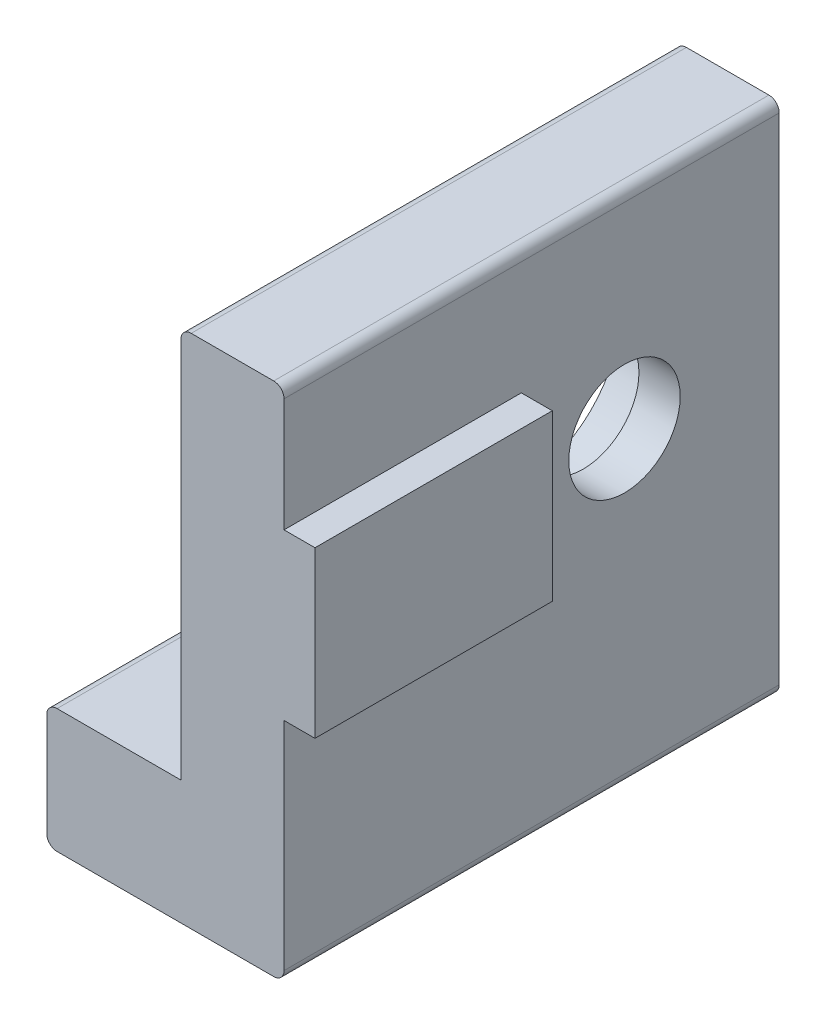
ISO-10303-21;
HEADER;
FILE_DESCRIPTION(('STEP AP214'),'2;1');
FILE_NAME('part.step','',(''),(''),'','','');
FILE_SCHEMA(('AUTOMOTIVE_DESIGN { 1 0 10303 214 1 1 1 1 }'));
ENDSEC;
DATA;
#1=APPLICATION_CONTEXT('core data for automotive mechanical design processes');
#2=APPLICATION_PROTOCOL_DEFINITION('international standard','automotive_design',2000,#1);
#3=PRODUCT_CONTEXT('',#1,'mechanical');
#4=PRODUCT('Part','Part','',(#3));
#5=PRODUCT_RELATED_PRODUCT_CATEGORY('part','',(#4));
#6=PRODUCT_DEFINITION_FORMATION('','',#4);
#7=PRODUCT_DEFINITION_CONTEXT('part definition',#1,'design');
#8=PRODUCT_DEFINITION('design','',#6,#7);
#9=PRODUCT_DEFINITION_SHAPE('','',#8);
#10=(LENGTH_UNIT() NAMED_UNIT(*) SI_UNIT(.MILLI.,.METRE.));
#11=(NAMED_UNIT(*) PLANE_ANGLE_UNIT() SI_UNIT($,.RADIAN.));
#12=(NAMED_UNIT(*) SI_UNIT($,.STERADIAN.) SOLID_ANGLE_UNIT());
#13=UNCERTAINTY_MEASURE_WITH_UNIT(LENGTH_MEASURE(1.E-05),#10,'distance_accuracy_value','');
#14=(GEOMETRIC_REPRESENTATION_CONTEXT(3) GLOBAL_UNCERTAINTY_ASSIGNED_CONTEXT((#13)) GLOBAL_UNIT_ASSIGNED_CONTEXT((#10,
#11,#12)) REPRESENTATION_CONTEXT('',''));
#15=CARTESIAN_POINT('',(0.,0.,0.));
#16=DIRECTION('',(0.,0.,1.));
#17=DIRECTION('',(1.,0.,0.));
#18=AXIS2_PLACEMENT_3D('',#15,#16,#17);
#19=CARTESIAN_POINT('',(0.,0.,24.));
#20=DIRECTION('',(1.,0.,0.));
#21=DIRECTION('',(0.,1.,0.));
#22=AXIS2_PLACEMENT_3D('',#19,#20,#21);
#23=PLANE('',#22);
#24=DIRECTION('',(0.,1.,0.));
#25=VECTOR('',#24,1.);
#26=CARTESIAN_POINT('',(0.,7.69614,15.6));
#27=LINE('',#26,#25);
#28=CARTESIAN_POINT('',(0.,7.69614,15.6));
#29=VERTEX_POINT('',#28);
#30=CARTESIAN_POINT('',(0.,9.48283,15.6));
#31=VERTEX_POINT('',#30);
#32=EDGE_CURVE('E208',#29,#31,#27,.T.);
#33=ORIENTED_EDGE('',*,*,#32,.F.);
#34=DIRECTION('',(0.,0.,-1.));
#35=VECTOR('',#34,1.);
#36=CARTESIAN_POINT('',(0.,7.69614,15.6));
#37=LINE('',#36,#35);
#38=CARTESIAN_POINT('',(0.,7.69614,12.));
#39=VERTEX_POINT('',#38);
#40=EDGE_CURVE('E191',#29,#39,#37,.T.);
#41=ORIENTED_EDGE('',*,*,#40,.T.);
#42=DIRECTION('',(0.,1.,0.));
#43=VECTOR('',#42,1.);
#44=CARTESIAN_POINT('',(0.,7.69614,12.));
#45=LINE('',#44,#43);
#46=CARTESIAN_POINT('',(0.,9.48283,12.));
#47=VERTEX_POINT('',#46);
#48=EDGE_CURVE('E221',#39,#47,#45,.T.);
#49=ORIENTED_EDGE('',*,*,#48,.T.);
#50=DIRECTION('',(0.,0.,-1.));
#51=VECTOR('',#50,1.);
#52=CARTESIAN_POINT('',(0.,9.48283,15.6));
#53=LINE('',#52,#51);
#54=EDGE_CURVE('E201',#31,#47,#53,.T.);
#55=ORIENTED_EDGE('',*,*,#54,.F.);
#56=EDGE_LOOP('',(#33,#41,#49,#55));
#57=FACE_BOUND('',#56,.T.);
#58=CARTESIAN_POINT('',(0.,2.5,7.5));
#59=DIRECTION('',(-1.,0.,0.));
#60=DIRECTION('',(0.,-1.,0.));
#61=AXIS2_PLACEMENT_3D('',#58,#59,#60);
#62=CIRCLE('',#61,4.8);
#63=CARTESIAN_POINT('',(0.,-2.3,7.5));
#64=VERTEX_POINT('',#63);
#65=EDGE_CURVE('E239',#64,#64,#62,.T.);
#66=ORIENTED_EDGE('',*,*,#65,.F.);
#67=EDGE_LOOP('',(#66));
#68=FACE_BOUND('',#67,.T.);
#69=DIRECTION('',(0.,-1.,0.));
#70=VECTOR('',#69,1.);
#71=CARTESIAN_POINT('',(0.,0.,24.));
#72=LINE('',#71,#70);
#73=CARTESIAN_POINT('',(0.,12.,24.));
#74=VERTEX_POINT('',#73);
#75=CARTESIAN_POINT('',(0.,-6.49999999999999,24.));
#76=VERTEX_POINT('',#75);
#77=EDGE_CURVE('E288',#74,#76,#72,.T.);
#78=ORIENTED_EDGE('',*,*,#77,.F.);
#79=DIRECTION('',(0.,0.,-1.));
#80=VECTOR('',#79,1.);
#81=CARTESIAN_POINT('',(0.,12.,24.));
#82=LINE('',#81,#80);
#83=CARTESIAN_POINT('',(0.,12.,0.));
#84=VERTEX_POINT('',#83);
#85=EDGE_CURVE('E355',#74,#84,#82,.T.);
#86=ORIENTED_EDGE('',*,*,#85,.T.);
#87=DIRECTION('',(0.,-1.,0.));
#88=VECTOR('',#87,1.);
#89=CARTESIAN_POINT('',(0.,0.,0.));
#90=LINE('',#89,#88);
#91=CARTESIAN_POINT('',(0.,-6.99999999999999,0.));
#92=VERTEX_POINT('',#91);
#93=EDGE_CURVE('E305',#84,#92,#90,.T.);
#94=ORIENTED_EDGE('',*,*,#93,.T.);
#95=CARTESIAN_POINT('',(0.,-6.99999999999999,1.18733454157178));
#96=DIRECTION('',(1.,0.,0.));
#97=DIRECTION('',(0.,0.,-1.));
#98=AXIS2_PLACEMENT_3D('',#95,#96,#97);
#99=ELLIPSE('',#98,1.18733454157178,0.5);
#100=CARTESIAN_POINT('',(0.,-6.49999999999999,1.18733454157178));
#101=VERTEX_POINT('',#100);
#102=EDGE_CURVE('E377',#92,#101,#99,.T.);
#103=ORIENTED_EDGE('',*,*,#102,.T.);
#104=DIRECTION('',(0.,0.,-1.));
#105=VECTOR('',#104,1.);
#106=CARTESIAN_POINT('',(0.,-6.49999999999999,24.));
#107=LINE('',#106,#105);
#108=EDGE_CURVE('E299',#76,#101,#107,.T.);
#109=ORIENTED_EDGE('',*,*,#108,.F.);
#110=EDGE_LOOP('',(#78,#86,#94,#103,#109));
#111=FACE_BOUND('',#110,.T.);
#112=DIRECTION('',(0.,1.,0.));
#113=VECTOR('',#112,1.);
#114=CARTESIAN_POINT('',(0.,-2.69614,15.6));
#115=LINE('',#114,#113);
#116=CARTESIAN_POINT('',(0.,-4.48283,15.6));
#117=VERTEX_POINT('',#116);
#118=CARTESIAN_POINT('',(0.,-2.69614,15.6));
#119=VERTEX_POINT('',#118);
#120=EDGE_CURVE('E202',#117,#119,#115,.T.);
#121=ORIENTED_EDGE('',*,*,#120,.F.);
#122=DIRECTION('',(0.,0.,-1.));
#123=VECTOR('',#122,1.);
#124=CARTESIAN_POINT('',(0.,-4.48283,15.6));
#125=LINE('',#124,#123);
#126=CARTESIAN_POINT('',(0.,-4.48283,12.));
#127=VERTEX_POINT('',#126);
#128=EDGE_CURVE('E229',#117,#127,#125,.T.);
#129=ORIENTED_EDGE('',*,*,#128,.T.);
#130=DIRECTION('',(0.,1.,0.));
#131=VECTOR('',#130,1.);
#132=CARTESIAN_POINT('',(0.,-2.69614,12.));
#133=LINE('',#132,#131);
#134=CARTESIAN_POINT('',(0.,-2.69614,12.));
#135=VERTEX_POINT('',#134);
#136=EDGE_CURVE('E212',#127,#135,#133,.T.);
#137=ORIENTED_EDGE('',*,*,#136,.T.);
#138=DIRECTION('',(0.,0.,-1.));
#139=VECTOR('',#138,1.);
#140=CARTESIAN_POINT('',(0.,-2.69614,15.6));
#141=LINE('',#140,#139);
#142=EDGE_CURVE('E226',#119,#135,#141,.T.);
#143=ORIENTED_EDGE('',*,*,#142,.F.);
#144=EDGE_LOOP('',(#121,#129,#137,#143));
#145=FACE_BOUND('',#144,.T.);
#146=ADVANCED_FACE('F39',(#57,#68,#111,#145),#23,.F.);
#147=CARTESIAN_POINT('',(6.5,2.5,7.5));
#148=DIRECTION('',(-1.,0.,0.));
#149=DIRECTION('',(0.,-1.,0.));
#150=AXIS2_PLACEMENT_3D('',#147,#148,#149);
#151=CYLINDRICAL_SURFACE('',#150,2.7);
#152=CARTESIAN_POINT('',(5.,2.5,7.5));
#153=DIRECTION('',(1.,0.,0.));
#154=DIRECTION('',(0.,1.,0.));
#155=AXIS2_PLACEMENT_3D('',#152,#153,#154);
#156=CIRCLE('',#155,2.7);
#157=CARTESIAN_POINT('',(5.,5.2,7.5));
#158=VERTEX_POINT('',#157);
#159=EDGE_CURVE('E243',#158,#158,#156,.T.);
#160=ORIENTED_EDGE('',*,*,#159,.T.);
#161=EDGE_LOOP('',(#160));
#162=FACE_BOUND('',#161,.T.);
#163=CARTESIAN_POINT('',(3.,2.5,7.5));
#164=DIRECTION('',(-1.,0.,0.));
#165=DIRECTION('',(0.,-1.,0.));
#166=AXIS2_PLACEMENT_3D('',#163,#164,#165);
#167=CIRCLE('',#166,2.7);
#168=CARTESIAN_POINT('',(3.,-0.2,7.5));
#169=VERTEX_POINT('',#168);
#170=EDGE_CURVE('E238',#169,#169,#167,.F.);
#171=ORIENTED_EDGE('',*,*,#170,.F.);
#172=EDGE_LOOP('',(#171));
#173=FACE_BOUND('',#172,.T.);
#174=ADVANCED_FACE('F415',(#162,#173),#151,.F.);
#175=CARTESIAN_POINT('',(0.,-1.49999999999999,24.));
#176=DIRECTION('',(0.,-1.,0.));
#177=DIRECTION('',(1.,0.,0.));
#178=AXIS2_PLACEMENT_3D('',#175,#176,#177);
#179=PLANE('',#178);
#180=DIRECTION('',(1.,0.,0.));
#181=VECTOR('',#180,1.);
#182=CARTESIAN_POINT('',(6.49999999999999,-1.5,12.5));
#183=LINE('',#182,#181);
#184=CARTESIAN_POINT('',(5.,-1.5,12.5));
#185=VERTEX_POINT('',#184);
#186=CARTESIAN_POINT('',(6.5,-1.5,12.5));
#187=VERTEX_POINT('',#186);
#188=EDGE_CURVE('E266',#185,#187,#183,.T.);
#189=ORIENTED_EDGE('',*,*,#188,.T.);
#190=DIRECTION('',(0.,0.,-1.));
#191=VECTOR('',#190,1.);
#192=CARTESIAN_POINT('',(6.5,-1.5,24.));
#193=LINE('',#192,#191);
#194=CARTESIAN_POINT('',(6.5,-1.5,24.));
#195=VERTEX_POINT('',#194);
#196=EDGE_CURVE('E317',#195,#187,#193,.T.);
#197=ORIENTED_EDGE('',*,*,#196,.F.);
#198=DIRECTION('',(-1.,0.,0.));
#199=VECTOR('',#198,1.);
#200=CARTESIAN_POINT('',(0.,-1.49999999999999,24.));
#201=LINE('',#200,#199);
#202=CARTESIAN_POINT('',(5.,-1.5,24.));
#203=VERTEX_POINT('',#202);
#204=EDGE_CURVE('E273',#195,#203,#201,.T.);
#205=ORIENTED_EDGE('',*,*,#204,.T.);
#206=DIRECTION('',(0.,0.,-1.));
#207=VECTOR('',#206,1.);
#208=CARTESIAN_POINT('',(5.,-1.5,24.));
#209=LINE('',#208,#207);
#210=EDGE_CURVE('E320',#203,#185,#209,.T.);
#211=ORIENTED_EDGE('',*,*,#210,.T.);
#212=EDGE_LOOP('',(#189,#197,#205,#211));
#213=FACE_BOUND('',#212,.T.);
#214=ADVANCED_FACE('F420',(#213),#179,.T.);
#215=CARTESIAN_POINT('',(6.5,0.,24.));
#216=DIRECTION('',(1.,0.,0.));
#217=DIRECTION('',(0.,1.,0.));
#218=AXIS2_PLACEMENT_3D('',#215,#216,#217);
#219=PLANE('',#218);
#220=DIRECTION('',(0.,-1.,0.));
#221=VECTOR('',#220,1.);
#222=CARTESIAN_POINT('',(6.5,12.501,12.5));
#223=LINE('',#222,#221);
#224=CARTESIAN_POINT('',(6.5,6.50000000000001,12.5));
#225=VERTEX_POINT('',#224);
#226=EDGE_CURVE('E256',#225,#187,#223,.T.);
#227=ORIENTED_EDGE('',*,*,#226,.F.);
#228=DIRECTION('',(0.,0.,-1.));
#229=VECTOR('',#228,1.);
#230=CARTESIAN_POINT('',(6.5,6.50000000000001,24.));
#231=LINE('',#230,#229);
#232=CARTESIAN_POINT('',(6.5,6.50000000000001,24.));
#233=VERTEX_POINT('',#232);
#234=EDGE_CURVE('E314',#233,#225,#231,.T.);
#235=ORIENTED_EDGE('',*,*,#234,.F.);
#236=DIRECTION('',(0.,-1.,0.));
#237=VECTOR('',#236,1.);
#238=CARTESIAN_POINT('',(6.5,0.,24.));
#239=LINE('',#238,#237);
#240=EDGE_CURVE('E277',#233,#195,#239,.T.);
#241=ORIENTED_EDGE('',*,*,#240,.T.);
#242=ORIENTED_EDGE('',*,*,#196,.T.);
#243=EDGE_LOOP('',(#227,#235,#241,#242));
#244=FACE_BOUND('',#243,.T.);
#245=ADVANCED_FACE('F437',(#244),#219,.T.);
#246=CARTESIAN_POINT('',(0.,6.50000000000001,24.));
#247=DIRECTION('',(0.,1.,0.));
#248=DIRECTION('',(0.,0.,1.));
#249=AXIS2_PLACEMENT_3D('',#246,#247,#248);
#250=PLANE('',#249);
#251=DIRECTION('',(-1.,0.,0.));
#252=VECTOR('',#251,1.);
#253=CARTESIAN_POINT('',(6.5,6.50000000000001,12.5));
#254=LINE('',#253,#252);
#255=CARTESIAN_POINT('',(5.,6.50000000000001,12.5));
#256=VERTEX_POINT('',#255);
#257=EDGE_CURVE('E262',#225,#256,#254,.T.);
#258=ORIENTED_EDGE('',*,*,#257,.T.);
#259=DIRECTION('',(0.,0.,-1.));
#260=VECTOR('',#259,1.);
#261=CARTESIAN_POINT('',(5.,6.50000000000001,24.));
#262=LINE('',#261,#260);
#263=CARTESIAN_POINT('',(5.,6.50000000000001,24.));
#264=VERTEX_POINT('',#263);
#265=EDGE_CURVE('E311',#264,#256,#262,.T.);
#266=ORIENTED_EDGE('',*,*,#265,.F.);
#267=DIRECTION('',(1.,0.,0.));
#268=VECTOR('',#267,1.);
#269=CARTESIAN_POINT('',(0.,6.50000000000001,24.));
#270=LINE('',#269,#268);
#271=EDGE_CURVE('E280',#264,#233,#270,.T.);
#272=ORIENTED_EDGE('',*,*,#271,.T.);
#273=ORIENTED_EDGE('',*,*,#234,.T.);
#274=EDGE_LOOP('',(#258,#266,#272,#273));
#275=FACE_BOUND('',#274,.T.);
#276=ADVANCED_FACE('F433',(#275),#250,.T.);
#277=CARTESIAN_POINT('',(5.,0.,24.));
#278=DIRECTION('',(1.,0.,0.));
#279=DIRECTION('',(0.,1.,0.));
#280=AXIS2_PLACEMENT_3D('',#277,#278,#279);
#281=PLANE('',#280);
#282=ORIENTED_EDGE('',*,*,#159,.F.);
#283=EDGE_LOOP('',(#282));
#284=FACE_BOUND('',#283,.T.);
#285=DIRECTION('',(0.,-1.,0.));
#286=VECTOR('',#285,1.);
#287=CARTESIAN_POINT('',(5.,0.,24.));
#288=LINE('',#287,#286);
#289=CARTESIAN_POINT('',(5.,-12.,24.));
#290=VERTEX_POINT('',#289);
#291=EDGE_CURVE('E270',#203,#290,#288,.T.);
#292=ORIENTED_EDGE('',*,*,#291,.T.);
#293=DIRECTION('',(0.,0.,-1.));
#294=VECTOR('',#293,1.);
#295=CARTESIAN_POINT('',(5.00000000000001,-12.,24.));
#296=LINE('',#295,#294);
#297=CARTESIAN_POINT('',(5.00000000000001,-12.,0.));
#298=VERTEX_POINT('',#297);
#299=EDGE_CURVE('E327',#290,#298,#296,.T.);
#300=ORIENTED_EDGE('',*,*,#299,.T.);
#301=DIRECTION('',(0.,-1.,0.));
#302=VECTOR('',#301,1.);
#303=CARTESIAN_POINT('',(5.,0.,0.));
#304=LINE('',#303,#302);
#305=CARTESIAN_POINT('',(5.,12.,0.));
#306=VERTEX_POINT('',#305);
#307=EDGE_CURVE('E269',#306,#298,#304,.T.);
#308=ORIENTED_EDGE('',*,*,#307,.F.);
#309=DIRECTION('',(0.,0.,-1.));
#310=VECTOR('',#309,1.);
#311=CARTESIAN_POINT('',(5.,12.,24.));
#312=LINE('',#311,#310);
#313=CARTESIAN_POINT('',(5.,12.,24.));
#314=VERTEX_POINT('',#313);
#315=EDGE_CURVE('E323',#306,#314,#312,.F.);
#316=ORIENTED_EDGE('',*,*,#315,.T.);
#317=DIRECTION('',(0.,-1.,0.));
#318=VECTOR('',#317,1.);
#319=CARTESIAN_POINT('',(5.,0.,24.));
#320=LINE('',#319,#318);
#321=EDGE_CURVE('E283',#314,#264,#320,.T.);
#322=ORIENTED_EDGE('',*,*,#321,.T.);
#323=ORIENTED_EDGE('',*,*,#265,.T.);
#324=DIRECTION('',(0.,-1.,0.));
#325=VECTOR('',#324,1.);
#326=CARTESIAN_POINT('',(5.,12.501,12.5));
#327=LINE('',#326,#325);
#328=EDGE_CURVE('E259',#256,#185,#327,.T.);
#329=ORIENTED_EDGE('',*,*,#328,.T.);
#330=ORIENTED_EDGE('',*,*,#210,.F.);
#331=EDGE_LOOP('',(#292,#300,#308,#316,#322,#323,#329,#330));
#332=FACE_BOUND('',#331,.T.);
#333=ADVANCED_FACE('F429',(#284,#332),#281,.T.);
#334=CARTESIAN_POINT('',(0.,12.5,24.));
#335=DIRECTION('',(0.,-1.,0.));
#336=DIRECTION('',(0.,0.,-1.));
#337=AXIS2_PLACEMENT_3D('',#334,#335,#336);
#338=PLANE('',#337);
#339=DIRECTION('',(-1.,0.,0.));
#340=VECTOR('',#339,1.);
#341=CARTESIAN_POINT('',(0.,12.5,0.));
#342=LINE('',#341,#340);
#343=CARTESIAN_POINT('',(4.5,12.5,0.));
#344=VERTEX_POINT('',#343);
#345=CARTESIAN_POINT('',(0.5,12.5,0.));
#346=VERTEX_POINT('',#345);
#347=EDGE_CURVE('E302',#344,#346,#342,.T.);
#348=ORIENTED_EDGE('',*,*,#347,.T.);
#349=DIRECTION('',(0.,0.,-1.));
#350=VECTOR('',#349,1.);
#351=CARTESIAN_POINT('',(0.5,12.5,24.));
#352=LINE('',#351,#350);
#353=CARTESIAN_POINT('',(0.5,12.5,24.));
#354=VERTEX_POINT('',#353);
#355=EDGE_CURVE('E361',#346,#354,#352,.F.);
#356=ORIENTED_EDGE('',*,*,#355,.T.);
#357=DIRECTION('',(-1.,0.,0.));
#358=VECTOR('',#357,1.);
#359=CARTESIAN_POINT('',(0.,12.5,24.));
#360=LINE('',#359,#358);
#361=CARTESIAN_POINT('',(4.5,12.5,24.));
#362=VERTEX_POINT('',#361);
#363=EDGE_CURVE('E285',#362,#354,#360,.T.);
#364=ORIENTED_EDGE('',*,*,#363,.F.);
#365=DIRECTION('',(0.,0.,-1.));
#366=VECTOR('',#365,1.);
#367=CARTESIAN_POINT('',(4.5,12.5,0.));
#368=LINE('',#367,#366);
#369=EDGE_CURVE('E358',#362,#344,#368,.T.);
#370=ORIENTED_EDGE('',*,*,#369,.T.);
#371=EDGE_LOOP('',(#348,#356,#364,#370));
#372=FACE_BOUND('',#371,.T.);
#373=ADVANCED_FACE('F426',(#372),#338,.F.);
#374=CARTESIAN_POINT('',(0.,-6.49999999999999,24.));
#375=DIRECTION('',(0.,-1.,0.));
#376=DIRECTION('',(1.,0.,0.));
#377=AXIS2_PLACEMENT_3D('',#374,#375,#376);
#378=PLANE('',#377);
#379=CARTESIAN_POINT('',(-3.,-6.49999999999999,19.));
#380=DIRECTION('',(0.,-1.,0.));
#381=DIRECTION('',(1.,0.,0.));
#382=AXIS2_PLACEMENT_3D('',#379,#380,#381);
#383=CIRCLE('',#382,1.25);
#384=CARTESIAN_POINT('',(-1.75,-6.49999999999999,19.));
#385=VERTEX_POINT('',#384);
#386=EDGE_CURVE('E249',#385,#385,#383,.F.);
#387=ORIENTED_EDGE('',*,*,#386,.F.);
#388=EDGE_LOOP('',(#387));
#389=FACE_BOUND('',#388,.T.);
#390=DIRECTION('',(0.421111306454629,0.,-0.907008967748432));
#391=VECTOR('',#390,1.);
#392=CARTESIAN_POINT('',(-8.71333706911634,-6.49999999999999,19.9545220750531));
#393=LINE('',#392,#391);
#394=CARTESIAN_POINT('',(-6.,-6.49999999999999,14.1104114646487));
#395=VERTEX_POINT('',#394);
#396=EDGE_CURVE('E373',#101,#395,#393,.F.);
#397=ORIENTED_EDGE('',*,*,#396,.T.);
#398=DIRECTION('',(0.,0.,-1.));
#399=VECTOR('',#398,1.);
#400=CARTESIAN_POINT('',(-6.,-6.49999999999999,24.));
#401=LINE('',#400,#399);
#402=CARTESIAN_POINT('',(-6.,-6.49999999999999,24.));
#403=VERTEX_POINT('',#402);
#404=EDGE_CURVE('E375',#395,#403,#401,.F.);
#405=ORIENTED_EDGE('',*,*,#404,.T.);
#406=DIRECTION('',(-1.,0.,0.));
#407=VECTOR('',#406,1.);
#408=CARTESIAN_POINT('',(0.,-6.49999999999999,24.));
#409=LINE('',#408,#407);
#410=EDGE_CURVE('E290',#76,#403,#409,.T.);
#411=ORIENTED_EDGE('',*,*,#410,.F.);
#412=ORIENTED_EDGE('',*,*,#108,.T.);
#413=EDGE_LOOP('',(#397,#405,#411,#412));
#414=FACE_BOUND('',#413,.T.);
#415=ADVANCED_FACE('F424',(#389,#414),#378,.F.);
#416=CARTESIAN_POINT('',(-6.5,0.,24.));
#417=DIRECTION('',(1.,0.,0.));
#418=DIRECTION('',(0.,1.,0.));
#419=AXIS2_PLACEMENT_3D('',#416,#417,#418);
#420=PLANE('',#419);
#421=DIRECTION('',(0.,-1.,0.));
#422=VECTOR('',#421,1.);
#423=CARTESIAN_POINT('',(-6.5,12.501,14.));
#424=LINE('',#423,#422);
#425=CARTESIAN_POINT('',(-6.5,-7.,14.));
#426=VERTEX_POINT('',#425);
#427=CARTESIAN_POINT('',(-6.5,-12.,14.));
#428=VERTEX_POINT('',#427);
#429=EDGE_CURVE('E253',#426,#428,#424,.T.);
#430=ORIENTED_EDGE('',*,*,#429,.T.);
#431=DIRECTION('',(0.,0.,-1.));
#432=VECTOR('',#431,1.);
#433=CARTESIAN_POINT('',(-6.5,-12.,24.));
#434=LINE('',#433,#432);
#435=CARTESIAN_POINT('',(-6.5,-12.,24.));
#436=VERTEX_POINT('',#435);
#437=EDGE_CURVE('E366',#428,#436,#434,.F.);
#438=ORIENTED_EDGE('',*,*,#437,.T.);
#439=DIRECTION('',(0.,-1.,0.));
#440=VECTOR('',#439,1.);
#441=CARTESIAN_POINT('',(-6.5,0.,24.));
#442=LINE('',#441,#440);
#443=CARTESIAN_POINT('',(-6.5,-6.99999999999999,24.));
#444=VERTEX_POINT('',#443);
#445=EDGE_CURVE('E293',#444,#436,#442,.T.);
#446=ORIENTED_EDGE('',*,*,#445,.F.);
#447=DIRECTION('',(0.,0.,-1.));
#448=VECTOR('',#447,1.);
#449=CARTESIAN_POINT('',(-6.5,-6.99999999999999,24.));
#450=LINE('',#449,#448);
#451=EDGE_CURVE('E363',#444,#426,#450,.T.);
#452=ORIENTED_EDGE('',*,*,#451,.T.);
#453=EDGE_LOOP('',(#430,#438,#446,#452));
#454=FACE_BOUND('',#453,.T.);
#455=ADVANCED_FACE('F480',(#454),#420,.F.);
#456=CARTESIAN_POINT('',(0.,-12.5,24.));
#457=DIRECTION('',(0.,-1.,0.));
#458=DIRECTION('',(1.,0.,0.));
#459=AXIS2_PLACEMENT_3D('',#456,#457,#458);
#460=PLANE('',#459);
#461=CARTESIAN_POINT('',(-3.,-12.5,19.));
#462=DIRECTION('',(0.,-1.,0.));
#463=DIRECTION('',(1.,0.,0.));
#464=AXIS2_PLACEMENT_3D('',#461,#462,#463);
#465=CIRCLE('',#464,1.25);
#466=CARTESIAN_POINT('',(-1.75,-12.5,19.));
#467=VERTEX_POINT('',#466);
#468=EDGE_CURVE('E246',#467,#467,#465,.T.);
#469=ORIENTED_EDGE('',*,*,#468,.F.);
#470=EDGE_LOOP('',(#469));
#471=FACE_BOUND('',#470,.T.);
#472=DIRECTION('',(-1.,0.,0.));
#473=VECTOR('',#472,1.);
#474=CARTESIAN_POINT('',(0.,-12.5,0.));
#475=LINE('',#474,#473);
#476=CARTESIAN_POINT('',(4.50000000000001,-12.5,0.));
#477=VERTEX_POINT('',#476);
#478=CARTESIAN_POINT('',(0.551262465729756,-12.5,0.));
#479=VERTEX_POINT('',#478);
#480=EDGE_CURVE('E274',#477,#479,#475,.T.);
#481=ORIENTED_EDGE('',*,*,#480,.F.);
#482=DIRECTION('',(0.,0.,-1.));
#483=VECTOR('',#482,1.);
#484=CARTESIAN_POINT('',(4.50000000000001,-12.5,24.));
#485=LINE('',#484,#483);
#486=CARTESIAN_POINT('',(4.50000000000001,-12.5,24.));
#487=VERTEX_POINT('',#486);
#488=EDGE_CURVE('E343',#477,#487,#485,.F.);
#489=ORIENTED_EDGE('',*,*,#488,.T.);
#490=DIRECTION('',(-1.,0.,0.));
#491=VECTOR('',#490,1.);
#492=CARTESIAN_POINT('',(0.,-12.5,24.));
#493=LINE('',#492,#491);
#494=CARTESIAN_POINT('',(-6.,-12.5,24.));
#495=VERTEX_POINT('',#494);
#496=EDGE_CURVE('E296',#487,#495,#493,.T.);
#497=ORIENTED_EDGE('',*,*,#496,.T.);
#498=DIRECTION('',(0.,0.,-1.));
#499=VECTOR('',#498,1.);
#500=CARTESIAN_POINT('',(-6.,-12.5,14.));
#501=LINE('',#500,#499);
#502=CARTESIAN_POINT('',(-6.,-12.5,14.1104114646487));
#503=VERTEX_POINT('',#502);
#504=EDGE_CURVE('E340',#495,#503,#501,.T.);
#505=ORIENTED_EDGE('',*,*,#504,.T.);
#506=DIRECTION('',(-0.421111306454629,0.,0.907008967748432));
#507=VECTOR('',#506,1.);
#508=CARTESIAN_POINT('',(0.453504483874217,-12.5,0.210555653227314));
#509=LINE('',#508,#507);
#510=EDGE_CURVE('E338',#503,#479,#509,.F.);
#511=ORIENTED_EDGE('',*,*,#510,.T.);
#512=EDGE_LOOP('',(#481,#489,#497,#505,#511));
#513=FACE_BOUND('',#512,.T.);
#514=ADVANCED_FACE('F490',(#471,#513),#460,.T.);
#515=CARTESIAN_POINT('',(0.,0.,24.));
#516=DIRECTION('',(0.,0.,1.));
#517=DIRECTION('',(1.,0.,0.));
#518=AXIS2_PLACEMENT_3D('',#515,#516,#517);
#519=PLANE('',#518);
#520=ORIENTED_EDGE('',*,*,#496,.F.);
#521=CARTESIAN_POINT('',(4.50000000000001,-12.,24.));
#522=DIRECTION('',(0.,0.,1.));
#523=DIRECTION('',(1.,0.,0.));
#524=AXIS2_PLACEMENT_3D('',#521,#522,#523);
#525=CIRCLE('',#524,0.5);
#526=EDGE_CURVE('E353',#487,#290,#525,.T.);
#527=ORIENTED_EDGE('',*,*,#526,.T.);
#528=ORIENTED_EDGE('',*,*,#291,.F.);
#529=ORIENTED_EDGE('',*,*,#204,.F.);
#530=ORIENTED_EDGE('',*,*,#240,.F.);
#531=ORIENTED_EDGE('',*,*,#271,.F.);
#532=ORIENTED_EDGE('',*,*,#321,.F.);
#533=CARTESIAN_POINT('',(4.5,12.,24.));
#534=DIRECTION('',(0.,0.,1.));
#535=DIRECTION('',(1.,0.,0.));
#536=AXIS2_PLACEMENT_3D('',#533,#534,#535);
#537=CIRCLE('',#536,0.5);
#538=EDGE_CURVE('E349',#314,#362,#537,.T.);
#539=ORIENTED_EDGE('',*,*,#538,.T.);
#540=ORIENTED_EDGE('',*,*,#363,.T.);
#541=CARTESIAN_POINT('',(0.5,12.,24.));
#542=DIRECTION('',(0.,0.,1.));
#543=DIRECTION('',(1.,0.,0.));
#544=AXIS2_PLACEMENT_3D('',#541,#542,#543);
#545=CIRCLE('',#544,0.5);
#546=EDGE_CURVE('E351',#354,#74,#545,.T.);
#547=ORIENTED_EDGE('',*,*,#546,.T.);
#548=ORIENTED_EDGE('',*,*,#77,.T.);
#549=ORIENTED_EDGE('',*,*,#410,.T.);
#550=CARTESIAN_POINT('',(-6.,-6.99999999999999,24.));
#551=DIRECTION('',(0.,0.,1.));
#552=DIRECTION('',(1.,0.,0.));
#553=AXIS2_PLACEMENT_3D('',#550,#551,#552);
#554=CIRCLE('',#553,0.5);
#555=EDGE_CURVE('E345',#403,#444,#554,.T.);
#556=ORIENTED_EDGE('',*,*,#555,.T.);
#557=ORIENTED_EDGE('',*,*,#445,.T.);
#558=CARTESIAN_POINT('',(-6.,-12.,24.));
#559=DIRECTION('',(0.,0.,1.));
#560=DIRECTION('',(1.,0.,0.));
#561=AXIS2_PLACEMENT_3D('',#558,#559,#560);
#562=CIRCLE('',#561,0.5);
#563=EDGE_CURVE('E347',#436,#495,#562,.T.);
#564=ORIENTED_EDGE('',*,*,#563,.T.);
#565=EDGE_LOOP('',(#520,#527,#528,#529,#530,#531,#532,#539,#540,#547,#548,#549,#556,#557,#564));
#566=FACE_BOUND('',#565,.T.);
#567=ADVANCED_FACE('F476',(#566),#519,.T.);
#568=CARTESIAN_POINT('',(0.,0.,0.));
#569=DIRECTION('',(0.,0.,1.));
#570=DIRECTION('',(1.,0.,0.));
#571=AXIS2_PLACEMENT_3D('',#568,#569,#570);
#572=PLANE('',#571);
#573=ORIENTED_EDGE('',*,*,#307,.T.);
#574=CARTESIAN_POINT('',(4.50000000000001,-12.,0.));
#575=DIRECTION('',(0.,0.,1.));
#576=DIRECTION('',(1.,0.,0.));
#577=AXIS2_PLACEMENT_3D('',#574,#575,#576);
#578=CIRCLE('',#577,0.5);
#579=EDGE_CURVE('E336',#298,#477,#578,.F.);
#580=ORIENTED_EDGE('',*,*,#579,.T.);
#581=ORIENTED_EDGE('',*,*,#480,.T.);
#582=CARTESIAN_POINT('',(0.551262465729756,-12.,0.));
#583=DIRECTION('',(0.,0.,1.));
#584=DIRECTION('',(1.,0.,0.));
#585=AXIS2_PLACEMENT_3D('',#582,#583,#584);
#586=ELLIPSE('',#585,0.551262465729755,0.5);
#587=CARTESIAN_POINT('',(0.,-12.,0.));
#588=VERTEX_POINT('',#587);
#589=EDGE_CURVE('E330',#479,#588,#586,.F.);
#590=ORIENTED_EDGE('',*,*,#589,.T.);
#591=DIRECTION('',(0.,-1.,0.));
#592=VECTOR('',#591,1.);
#593=CARTESIAN_POINT('',(0.,12.501,0.));
#594=LINE('',#593,#592);
#595=EDGE_CURVE('E252',#92,#588,#594,.T.);
#596=ORIENTED_EDGE('',*,*,#595,.F.);
#597=ORIENTED_EDGE('',*,*,#93,.F.);
#598=CARTESIAN_POINT('',(0.5,12.,0.));
#599=DIRECTION('',(0.,0.,1.));
#600=DIRECTION('',(1.,0.,0.));
#601=AXIS2_PLACEMENT_3D('',#598,#599,#600);
#602=CIRCLE('',#601,0.5);
#603=EDGE_CURVE('E334',#84,#346,#602,.F.);
#604=ORIENTED_EDGE('',*,*,#603,.T.);
#605=ORIENTED_EDGE('',*,*,#347,.F.);
#606=CARTESIAN_POINT('',(4.5,12.,0.));
#607=DIRECTION('',(0.,0.,1.));
#608=DIRECTION('',(1.,0.,0.));
#609=AXIS2_PLACEMENT_3D('',#606,#607,#608);
#610=CIRCLE('',#609,0.5);
#611=EDGE_CURVE('E332',#344,#306,#610,.F.);
#612=ORIENTED_EDGE('',*,*,#611,.T.);
#613=EDGE_LOOP('',(#573,#580,#581,#590,#596,#597,#604,#605,#612));
#614=FACE_BOUND('',#613,.T.);
#615=ADVANCED_FACE('F499',(#614),#572,.F.);
#616=CARTESIAN_POINT('',(6.5,12.501,12.5));
#617=DIRECTION('',(0.,0.,1.));
#618=DIRECTION('',(1.,0.,0.));
#619=AXIS2_PLACEMENT_3D('',#616,#617,#618);
#620=PLANE('',#619);
#621=ORIENTED_EDGE('',*,*,#328,.F.);
#622=ORIENTED_EDGE('',*,*,#257,.F.);
#623=ORIENTED_EDGE('',*,*,#226,.T.);
#624=ORIENTED_EDGE('',*,*,#188,.F.);
#625=EDGE_LOOP('',(#621,#622,#623,#624));
#626=FACE_BOUND('',#625,.T.);
#627=ADVANCED_FACE('F534',(#626),#620,.F.);
#628=CARTESIAN_POINT('',(0.,12.501,0.));
#629=DIRECTION('',(0.907008967748432,0.,0.421111306454629));
#630=DIRECTION('',(0.421111306454629,0.,-0.907008967748432));
#631=AXIS2_PLACEMENT_3D('',#628,#629,#630);
#632=PLANE('',#631);
#633=ORIENTED_EDGE('',*,*,#595,.T.);
#634=DIRECTION('',(-0.421111306454629,0.,0.907008967748432));
#635=VECTOR('',#634,1.);
#636=CARTESIAN_POINT('',(-6.5,-12.,14.));
#637=LINE('',#636,#635);
#638=EDGE_CURVE('E371',#588,#428,#637,.T.);
#639=ORIENTED_EDGE('',*,*,#638,.T.);
#640=ORIENTED_EDGE('',*,*,#429,.F.);
#641=DIRECTION('',(0.421111306454629,0.,-0.907008967748432));
#642=VECTOR('',#641,1.);
#643=CARTESIAN_POINT('',(0.,-6.99999999999999,0.));
#644=LINE('',#643,#642);
#645=EDGE_CURVE('E368',#426,#92,#644,.T.);
#646=ORIENTED_EDGE('',*,*,#645,.T.);
#647=EDGE_LOOP('',(#633,#639,#640,#646));
#648=FACE_BOUND('',#647,.T.);
#649=ADVANCED_FACE('F409',(#648),#632,.F.);
#650=CARTESIAN_POINT('',(-3.,12.501,19.));
#651=DIRECTION('',(0.,-1.,0.));
#652=DIRECTION('',(1.,0.,0.));
#653=AXIS2_PLACEMENT_3D('',#650,#651,#652);
#654=CYLINDRICAL_SURFACE('',#653,1.25);
#655=ORIENTED_EDGE('',*,*,#468,.T.);
#656=EDGE_LOOP('',(#655));
#657=FACE_BOUND('',#656,.T.);
#658=ORIENTED_EDGE('',*,*,#386,.T.);
#659=EDGE_LOOP('',(#658));
#660=FACE_BOUND('',#659,.T.);
#661=ADVANCED_FACE('F401',(#657,#660),#654,.F.);
#662=CARTESIAN_POINT('',(3.,2.5,7.5));
#663=DIRECTION('',(-1.,0.,0.));
#664=DIRECTION('',(0.,-1.,0.));
#665=AXIS2_PLACEMENT_3D('',#662,#663,#664);
#666=PLANE('',#665);
#667=DIRECTION('',(0.,-1.,0.));
#668=VECTOR('',#667,1.);
#669=CARTESIAN_POINT('',(3.,2.5,12.));
#670=LINE('',#669,#668);
#671=CARTESIAN_POINT('',(3.,4.170329308849,12.));
#672=VERTEX_POINT('',#671);
#673=CARTESIAN_POINT('',(3.,0.829670691151002,12.));
#674=VERTEX_POINT('',#673);
#675=EDGE_CURVE('E228',#672,#674,#670,.T.);
#676=ORIENTED_EDGE('',*,*,#675,.F.);
#677=CARTESIAN_POINT('',(3.,2.5,7.5));
#678=DIRECTION('',(-1.,0.,0.));
#679=DIRECTION('',(0.,-1.,0.));
#680=AXIS2_PLACEMENT_3D('',#677,#678,#679);
#681=CIRCLE('',#680,4.8);
#682=EDGE_CURVE('E235',#672,#674,#681,.T.);
#683=ORIENTED_EDGE('',*,*,#682,.T.);
#684=EDGE_LOOP('',(#676,#683));
#685=FACE_BOUND('',#684,.T.);
#686=ORIENTED_EDGE('',*,*,#170,.T.);
#687=EDGE_LOOP('',(#686));
#688=FACE_BOUND('',#687,.T.);
#689=ADVANCED_FACE('F399',(#685,#688),#666,.T.);
#690=CARTESIAN_POINT('',(3.,2.5,7.5));
#691=DIRECTION('',(-1.,0.,0.));
#692=DIRECTION('',(0.,-1.,0.));
#693=AXIS2_PLACEMENT_3D('',#690,#691,#692);
#694=CYLINDRICAL_SURFACE('',#693,4.8);
#695=CARTESIAN_POINT('',(2.76280505190042,4.170329308849,12.));
#696=CARTESIAN_POINT('',(2.7914330913891,4.07161245260239,12.036656075157));
#697=CARTESIAN_POINT('',(2.81780757033274,3.9710794161372,12.070262406638));
#698=CARTESIAN_POINT('',(2.86565252911555,3.7668859186463,12.1310171672718));
#699=CARTESIAN_POINT('',(2.88712042540076,3.66322384239968,12.1581621945448));
#700=CARTESIAN_POINT('',(2.92469950769955,3.45352100010742,12.2055652297076));
#701=CARTESIAN_POINT('',(2.94081774786703,3.347483564915,12.2258323077864));
#702=CARTESIAN_POINT('',(2.96741723679765,3.1336112968194,12.2592274185609));
#703=CARTESIAN_POINT('',(2.97789967587381,3.02577684841987,12.2723569587513));
#704=CARTESIAN_POINT('',(2.99304209936836,2.80864387216258,12.2913108641226));
#705=CARTESIAN_POINT('',(2.99767987139033,2.69934134496686,12.2971073607175));
#706=CARTESIAN_POINT('',(3.00096007790679,2.48050623717922,12.3012078480674));
#707=CARTESIAN_POINT('',(2.99960254505911,2.3709736578437,12.2995118796357));
#708=CARTESIAN_POINT('',(2.99092306438241,2.15257998898984,12.288657856908));
#709=CARTESIAN_POINT('',(2.98360451367856,2.04371855258732,12.2795040527582));
#710=CARTESIAN_POINT('',(2.9631704556872,1.82744501503765,12.2538966156992));
#711=CARTESIAN_POINT('',(2.95005639915706,1.72003255810542,12.237444809655));
#712=CARTESIAN_POINT('',(2.91399457534464,1.47862899261192,12.1920843630666));
#713=CARTESIAN_POINT('',(2.88934745164237,1.34529509287939,12.1610113643322));
#714=CARTESIAN_POINT('',(2.83194883576074,1.08353620327955,12.0882638097356));
#715=CARTESIAN_POINT('',(2.79920815296106,0.955104927679549,12.0466033918712));
#716=CARTESIAN_POINT('',(2.76280505190042,0.829670691151002,12.));
#717=B_SPLINE_CURVE_WITH_KNOTS('',3,(#695,#696,#697,#698,#699,#700,#701,#702,#703,#704,#705,
#706,#707,#708,#709,#710,#711,#712,#713,#714,#715,#716),.UNSPECIFIED.,.F.,.F.,(4,2,2,2,2,2,2,2,
2,2,4),(0.,0.327335554419151,0.654843071842268,0.981917000074019,1.30892182128103,
1.63716569834952,1.9654077873981,2.29346294529702,2.62143602941169,3.03799394658121,
3.4539985060152),.UNSPECIFIED.);
#718=CARTESIAN_POINT('',(2.76280505190042,4.170329308849,12.));
#719=VERTEX_POINT('',#718);
#720=CARTESIAN_POINT('',(2.76280505190042,0.829670691151002,12.));
#721=VERTEX_POINT('',#720);
#722=EDGE_CURVE('E47',#719,#721,#717,.T.);
#723=ORIENTED_EDGE('',*,*,#722,.T.);
#724=DIRECTION('',(-1.,0.,0.));
#725=VECTOR('',#724,1.);
#726=CARTESIAN_POINT('',(3.,0.829670691151002,12.));
#727=LINE('',#726,#725);
#728=EDGE_CURVE('E11',#721,#674,#727,.F.);
#729=ORIENTED_EDGE('',*,*,#728,.T.);
#730=ORIENTED_EDGE('',*,*,#682,.F.);
#731=DIRECTION('',(-1.,0.,0.));
#732=VECTOR('',#731,1.);
#733=CARTESIAN_POINT('',(3.,4.170329308849,12.));
#734=LINE('',#733,#732);
#735=EDGE_CURVE('E379',#672,#719,#734,.T.);
#736=ORIENTED_EDGE('',*,*,#735,.T.);
#737=EDGE_LOOP('',(#723,#729,#730,#736));
#738=FACE_BOUND('',#737,.T.);
#739=ORIENTED_EDGE('',*,*,#65,.T.);
#740=EDGE_LOOP('',(#739));
#741=FACE_BOUND('',#740,.T.);
#742=ADVANCED_FACE('F388',(#738,#741),#694,.F.);
#743=CARTESIAN_POINT('',(4.50000000000001,-12.,24.));
#744=DIRECTION('',(0.,0.,-1.));
#745=DIRECTION('',(-1.,0.,0.));
#746=AXIS2_PLACEMENT_3D('',#743,#744,#745);
#747=CYLINDRICAL_SURFACE('',#746,0.5);
#748=ORIENTED_EDGE('',*,*,#526,.F.);
#749=ORIENTED_EDGE('',*,*,#488,.F.);
#750=ORIENTED_EDGE('',*,*,#579,.F.);
#751=ORIENTED_EDGE('',*,*,#299,.F.);
#752=EDGE_LOOP('',(#748,#749,#750,#751));
#753=FACE_BOUND('',#752,.T.);
#754=ADVANCED_FACE('F407',(#753),#747,.T.);
#755=CARTESIAN_POINT('',(0.5,12.,24.));
#756=DIRECTION('',(0.,0.,-1.));
#757=DIRECTION('',(-1.,0.,0.));
#758=AXIS2_PLACEMENT_3D('',#755,#756,#757);
#759=CYLINDRICAL_SURFACE('',#758,0.5);
#760=ORIENTED_EDGE('',*,*,#546,.F.);
#761=ORIENTED_EDGE('',*,*,#355,.F.);
#762=ORIENTED_EDGE('',*,*,#603,.F.);
#763=ORIENTED_EDGE('',*,*,#85,.F.);
#764=EDGE_LOOP('',(#760,#761,#762,#763));
#765=FACE_BOUND('',#764,.T.);
#766=ADVANCED_FACE('F447',(#765),#759,.T.);
#767=CARTESIAN_POINT('',(4.5,12.,24.));
#768=DIRECTION('',(0.,0.,1.));
#769=DIRECTION('',(1.,0.,0.));
#770=AXIS2_PLACEMENT_3D('',#767,#768,#769);
#771=CYLINDRICAL_SURFACE('',#770,0.5);
#772=ORIENTED_EDGE('',*,*,#538,.F.);
#773=ORIENTED_EDGE('',*,*,#315,.F.);
#774=ORIENTED_EDGE('',*,*,#611,.F.);
#775=ORIENTED_EDGE('',*,*,#369,.F.);
#776=EDGE_LOOP('',(#772,#773,#774,#775));
#777=FACE_BOUND('',#776,.T.);
#778=ADVANCED_FACE('F451',(#777),#771,.T.);
#779=CARTESIAN_POINT('',(0.453504483874217,-12.,0.210555653227314));
#780=DIRECTION('',(0.421111306454629,0.,-0.907008967748432));
#781=DIRECTION('',(-0.907008967748432,0.,-0.421111306454629));
#782=AXIS2_PLACEMENT_3D('',#779,#780,#781);
#783=CYLINDRICAL_SURFACE('',#782,0.5);
#784=ORIENTED_EDGE('',*,*,#589,.F.);
#785=ORIENTED_EDGE('',*,*,#510,.F.);
#786=CARTESIAN_POINT('',(-6.,-12.,14.1104114646487));
#787=DIRECTION('',(0.215628189543446,0.,-0.976475541872));
#788=DIRECTION('',(0.976475541872,0.,0.215628189543445));
#789=AXIS2_PLACEMENT_3D('',#786,#787,#788);
#790=ELLIPSE('',#789,0.51204559516304,0.5);
#791=EDGE_CURVE('E242',#428,#503,#790,.F.);
#792=ORIENTED_EDGE('',*,*,#791,.F.);
#793=ORIENTED_EDGE('',*,*,#638,.F.);
#794=EDGE_LOOP('',(#784,#785,#792,#793));
#795=FACE_BOUND('',#794,.T.);
#796=ADVANCED_FACE('F455',(#795),#783,.T.);
#797=CARTESIAN_POINT('',(-6.,-12.,24.));
#798=DIRECTION('',(0.,0.,1.));
#799=DIRECTION('',(1.,0.,0.));
#800=AXIS2_PLACEMENT_3D('',#797,#798,#799);
#801=CYLINDRICAL_SURFACE('',#800,0.5);
#802=ORIENTED_EDGE('',*,*,#563,.F.);
#803=ORIENTED_EDGE('',*,*,#437,.F.);
#804=ORIENTED_EDGE('',*,*,#791,.T.);
#805=ORIENTED_EDGE('',*,*,#504,.F.);
#806=EDGE_LOOP('',(#802,#803,#804,#805));
#807=FACE_BOUND('',#806,.T.);
#808=ADVANCED_FACE('F457',(#807),#801,.T.);
#809=CARTESIAN_POINT('',(0.453504483874217,-6.99999999999999,0.210555653227314));
#810=DIRECTION('',(0.421111306454629,0.,-0.907008967748432));
#811=DIRECTION('',(-0.907008967748432,0.,-0.421111306454629));
#812=AXIS2_PLACEMENT_3D('',#809,#810,#811);
#813=CYLINDRICAL_SURFACE('',#812,0.5);
#814=ORIENTED_EDGE('',*,*,#102,.F.);
#815=ORIENTED_EDGE('',*,*,#645,.F.);
#816=CARTESIAN_POINT('',(-6.,-6.99999999999999,14.1104114646487));
#817=DIRECTION('',(0.215628189543446,0.,-0.976475541872));
#818=DIRECTION('',(0.976475541872,0.,0.215628189543445));
#819=AXIS2_PLACEMENT_3D('',#816,#817,#818);
#820=ELLIPSE('',#819,0.51204559516304,0.5);
#821=EDGE_CURVE('E234',#395,#426,#820,.F.);
#822=ORIENTED_EDGE('',*,*,#821,.F.);
#823=ORIENTED_EDGE('',*,*,#396,.F.);
#824=EDGE_LOOP('',(#814,#815,#822,#823));
#825=FACE_BOUND('',#824,.T.);
#826=ADVANCED_FACE('F41',(#825),#813,.T.);
#827=CARTESIAN_POINT('',(-6.,-6.99999999999999,24.));
#828=DIRECTION('',(0.,0.,-1.));
#829=DIRECTION('',(-1.,0.,0.));
#830=AXIS2_PLACEMENT_3D('',#827,#828,#829);
#831=CYLINDRICAL_SURFACE('',#830,0.5);
#832=ORIENTED_EDGE('',*,*,#555,.F.);
#833=ORIENTED_EDGE('',*,*,#404,.F.);
#834=ORIENTED_EDGE('',*,*,#821,.T.);
#835=ORIENTED_EDGE('',*,*,#451,.F.);
#836=EDGE_LOOP('',(#832,#833,#834,#835));
#837=FACE_BOUND('',#836,.T.);
#838=ADVANCED_FACE('F396',(#837),#831,.T.);
#839=CARTESIAN_POINT('',(-2.99999074009783,2.5,15.6));
#840=DIRECTION('',(0.,0.,-1.));
#841=DIRECTION('',(-1.,0.,0.));
#842=AXIS2_PLACEMENT_3D('',#839,#840,#841);
#843=CYLINDRICAL_SURFACE('',#842,5.99998461166966);
#844=CARTESIAN_POINT('',(-2.99999074009783,2.5,12.));
#845=DIRECTION('',(0.,0.,1.));
#846=DIRECTION('',(-1.,0.,0.));
#847=AXIS2_PLACEMENT_3D('',#844,#845,#846);
#848=CIRCLE('',#847,5.99998461166966);
#849=EDGE_CURVE('E197',#719,#39,#848,.T.);
#850=ORIENTED_EDGE('',*,*,#849,.T.);
#851=ORIENTED_EDGE('',*,*,#40,.F.);
#852=CARTESIAN_POINT('',(-2.99999074009783,2.5,15.6));
#853=DIRECTION('',(0.,0.,1.));
#854=DIRECTION('',(-1.,0.,0.));
#855=AXIS2_PLACEMENT_3D('',#852,#853,#854);
#856=CIRCLE('',#855,5.99998461166966);
#857=EDGE_CURVE('E194',#119,#29,#856,.T.);
#858=ORIENTED_EDGE('',*,*,#857,.F.);
#859=ORIENTED_EDGE('',*,*,#142,.T.);
#860=EDGE_CURVE('E54',#135,#721,#848,.T.);
#861=ORIENTED_EDGE('',*,*,#860,.T.);
#862=ORIENTED_EDGE('',*,*,#722,.F.);
#863=EDGE_LOOP('',(#850,#851,#858,#859,#861,#862));
#864=FACE_BOUND('',#863,.T.);
#865=ADVANCED_FACE('F193',(#864),#843,.T.);
#866=CARTESIAN_POINT('',(-2.99999074009783,2.5,12.));
#867=DIRECTION('',(0.,0.,-1.));
#868=DIRECTION('',(-1.,0.,0.));
#869=AXIS2_PLACEMENT_3D('',#866,#867,#868);
#870=PLANE('',#869);
#871=ORIENTED_EDGE('',*,*,#860,.F.);
#872=ORIENTED_EDGE('',*,*,#136,.F.);
#873=CARTESIAN_POINT('',(-2.99999074009783,2.5,12.));
#874=DIRECTION('',(0.,0.,-1.));
#875=DIRECTION('',(-1.,0.,0.));
#876=AXIS2_PLACEMENT_3D('',#873,#874,#875);
#877=CIRCLE('',#876,7.59999074009783);
#878=EDGE_CURVE('E60',#47,#127,#877,.T.);
#879=ORIENTED_EDGE('',*,*,#878,.F.);
#880=ORIENTED_EDGE('',*,*,#48,.F.);
#881=ORIENTED_EDGE('',*,*,#849,.F.);
#882=ORIENTED_EDGE('',*,*,#735,.F.);
#883=ORIENTED_EDGE('',*,*,#675,.T.);
#884=ORIENTED_EDGE('',*,*,#728,.F.);
#885=EDGE_LOOP('',(#871,#872,#879,#880,#881,#882,#883,#884));
#886=FACE_BOUND('',#885,.T.);
#887=ADVANCED_FACE('F395',(#886),#870,.F.);
#888=CARTESIAN_POINT('',(-2.99999074009783,2.5,15.6));
#889=DIRECTION('',(0.,0.,-1.));
#890=DIRECTION('',(-1.,0.,0.));
#891=AXIS2_PLACEMENT_3D('',#888,#889,#890);
#892=CYLINDRICAL_SURFACE('',#891,7.59999074009783);
#893=ORIENTED_EDGE('',*,*,#878,.T.);
#894=ORIENTED_EDGE('',*,*,#128,.F.);
#895=CARTESIAN_POINT('',(-2.99999074009783,2.5,15.6));
#896=DIRECTION('',(0.,0.,-1.));
#897=DIRECTION('',(-1.,0.,0.));
#898=AXIS2_PLACEMENT_3D('',#895,#896,#897);
#899=CIRCLE('',#898,7.59999074009783);
#900=EDGE_CURVE('E215',#31,#117,#899,.T.);
#901=ORIENTED_EDGE('',*,*,#900,.F.);
#902=ORIENTED_EDGE('',*,*,#54,.T.);
#903=EDGE_LOOP('',(#893,#894,#901,#902));
#904=FACE_BOUND('',#903,.T.);
#905=ADVANCED_FACE('F397',(#904),#892,.F.);
#906=CARTESIAN_POINT('',(-2.99999074009783,2.5,15.6));
#907=DIRECTION('',(0.,0.,-1.));
#908=DIRECTION('',(-1.,0.,0.));
#909=AXIS2_PLACEMENT_3D('',#906,#907,#908);
#910=PLANE('',#909);
#911=ORIENTED_EDGE('',*,*,#857,.T.);
#912=ORIENTED_EDGE('',*,*,#32,.T.);
#913=ORIENTED_EDGE('',*,*,#900,.T.);
#914=ORIENTED_EDGE('',*,*,#120,.T.);
#915=EDGE_LOOP('',(#911,#912,#913,#914));
#916=FACE_BOUND('',#915,.T.);
#917=ADVANCED_FACE('F206',(#916),#910,.T.);
#918=CLOSED_SHELL('',(#146,#174,#214,#245,#276,#333,#373,#415,#455,#514,#567,#615,#627,#649,
#661,#689,#742,#754,#766,#778,#796,#808,#826,#838,#865,#887,#905,#917));
#919=MANIFOLD_SOLID_BREP('B2',#918);
#920=ADVANCED_BREP_SHAPE_REPRESENTATION('',(#18,#919),#14);
#921=SHAPE_DEFINITION_REPRESENTATION(#9,#920);
ENDSEC;
END-ISO-10303-21;
